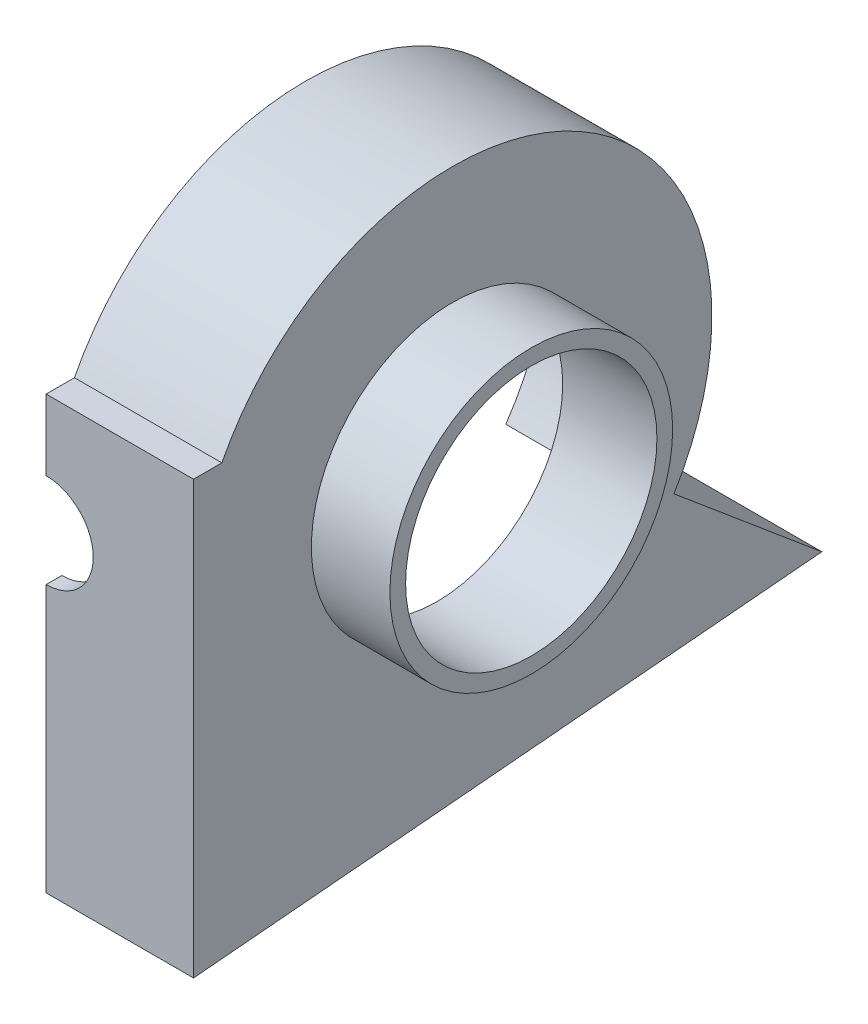
ISO-10303-21;
HEADER;
FILE_DESCRIPTION(('STEP AP214'),'2;1');
FILE_NAME('part.step','',(''),(''),'','','');
FILE_SCHEMA(('AUTOMOTIVE_DESIGN { 1 0 10303 214 1 1 1 1 }'));
ENDSEC;
DATA;
#1=APPLICATION_CONTEXT('core data for automotive mechanical design processes');
#2=APPLICATION_PROTOCOL_DEFINITION('international standard','automotive_design',2000,#1);
#3=PRODUCT_CONTEXT('',#1,'mechanical');
#4=PRODUCT('Part','Part','',(#3));
#5=PRODUCT_RELATED_PRODUCT_CATEGORY('part','',(#4));
#6=PRODUCT_DEFINITION_FORMATION('','',#4);
#7=PRODUCT_DEFINITION_CONTEXT('part definition',#1,'design');
#8=PRODUCT_DEFINITION('design','',#6,#7);
#9=PRODUCT_DEFINITION_SHAPE('','',#8);
#10=(LENGTH_UNIT() NAMED_UNIT(*) SI_UNIT(.MILLI.,.METRE.));
#11=(NAMED_UNIT(*) PLANE_ANGLE_UNIT() SI_UNIT($,.RADIAN.));
#12=(NAMED_UNIT(*) SI_UNIT($,.STERADIAN.) SOLID_ANGLE_UNIT());
#13=UNCERTAINTY_MEASURE_WITH_UNIT(LENGTH_MEASURE(1.E-05),#10,'distance_accuracy_value','');
#14=(GEOMETRIC_REPRESENTATION_CONTEXT(3) GLOBAL_UNCERTAINTY_ASSIGNED_CONTEXT((#13)) GLOBAL_UNIT_ASSIGNED_CONTEXT((#10,
#11,#12)) REPRESENTATION_CONTEXT('',''));
#15=CARTESIAN_POINT('',(0.,0.,0.));
#16=DIRECTION('',(0.,0.,1.));
#17=DIRECTION('',(1.,0.,0.));
#18=AXIS2_PLACEMENT_3D('',#15,#16,#17);
#19=CARTESIAN_POINT('',(-4.6925,35.,-20.));
#20=DIRECTION('',(1.,0.,0.));
#21=DIRECTION('',(0.,0.,1.));
#22=AXIS2_PLACEMENT_3D('',#19,#20,#21);
#23=PLANE('',#22);
#24=DIRECTION('',(0.,-1.,0.));
#25=VECTOR('',#24,1.);
#26=CARTESIAN_POINT('',(-4.6925,35.,19.));
#27=LINE('',#26,#25);
#28=CARTESIAN_POINT('',(-4.6925,13.5,19.));
#29=VERTEX_POINT('',#28);
#30=CARTESIAN_POINT('',(-4.6925,-2.40823803996742,19.));
#31=VERTEX_POINT('',#30);
#32=EDGE_CURVE('E194',#29,#31,#27,.T.);
#33=ORIENTED_EDGE('',*,*,#32,.T.);
#34=DIRECTION('',(0.,0.0871557427476513,-0.996194698091746));
#35=VECTOR('',#34,1.);
#36=CARTESIAN_POINT('',(-4.6925,1.26205902037806,-22.9516873664234));
#37=LINE('',#36,#35);
#38=CARTESIAN_POINT('',(-4.6925,0.785782121911663,-17.5078175063551));
#39=VERTEX_POINT('',#38);
#40=EDGE_CURVE('E161',#31,#39,#37,.T.);
#41=ORIENTED_EDGE('',*,*,#40,.T.);
#42=DIRECTION('',(0.,-0.642787609686538,-0.766044443118979));
#43=VECTOR('',#42,1.);
#44=CARTESIAN_POINT('',(-4.6925,13.6951124477097,-2.12307671259983));
#45=LINE('',#44,#43);
#46=CARTESIAN_POINT('',(-4.6925,7.70429056918022,-9.26266020892933));
#47=VERTEX_POINT('',#46);
#48=EDGE_CURVE('E190',#47,#39,#45,.T.);
#49=ORIENTED_EDGE('',*,*,#48,.F.);
#50=CARTESIAN_POINT('',(-4.6925,16.5,3.5));
#51=DIRECTION('',(-1.,0.,0.));
#52=DIRECTION('',(0.,0.,1.));
#53=AXIS2_PLACEMENT_3D('',#50,#51,#52);
#54=CIRCLE('',#53,15.5);
#55=CARTESIAN_POINT('',(-4.6925,23.,17.5712472794703));
#56=VERTEX_POINT('',#55);
#57=EDGE_CURVE('E173',#56,#47,#54,.T.);
#58=ORIENTED_EDGE('',*,*,#57,.F.);
#59=DIRECTION('',(0.,0.,1.));
#60=VECTOR('',#59,1.);
#61=CARTESIAN_POINT('',(-4.6925,23.,-20.));
#62=LINE('',#61,#60);
#63=CARTESIAN_POINT('',(-4.6925,23.,19.));
#64=VERTEX_POINT('',#63);
#65=EDGE_CURVE('E200',#56,#64,#62,.T.);
#66=ORIENTED_EDGE('',*,*,#65,.T.);
#67=CARTESIAN_POINT('',(-4.6925,19.5,19.));
#68=VERTEX_POINT('',#67);
#69=EDGE_CURVE('E178',#64,#68,#27,.T.);
#70=ORIENTED_EDGE('',*,*,#69,.T.);
#71=DIRECTION('',(0.,0.,1.));
#72=VECTOR('',#71,1.);
#73=CARTESIAN_POINT('',(-4.6925,19.5,13.));
#74=LINE('',#73,#72);
#75=CARTESIAN_POINT('',(-4.6925,19.5,20.));
#76=VERTEX_POINT('',#75);
#77=EDGE_CURVE('E140',#68,#76,#74,.T.);
#78=ORIENTED_EDGE('',*,*,#77,.T.);
#79=DIRECTION('',(0.,-1.,0.));
#80=VECTOR('',#79,1.);
#81=CARTESIAN_POINT('',(-4.6925,35.,20.));
#82=LINE('',#81,#80);
#83=CARTESIAN_POINT('',(-4.6925,24.,20.));
#84=VERTEX_POINT('',#83);
#85=EDGE_CURVE('E132',#84,#76,#82,.T.);
#86=ORIENTED_EDGE('',*,*,#85,.F.);
#87=DIRECTION('',(0.,0.,1.));
#88=VECTOR('',#87,1.);
#89=CARTESIAN_POINT('',(-4.6925,24.,0.));
#90=LINE('',#89,#88);
#91=CARTESIAN_POINT('',(-4.6925,24.,18.1969384566991));
#92=VERTEX_POINT('',#91);
#93=EDGE_CURVE('E216',#92,#84,#90,.T.);
#94=ORIENTED_EDGE('',*,*,#93,.F.);
#95=CARTESIAN_POINT('',(-4.6925,16.5,3.5));
#96=DIRECTION('',(-1.,0.,0.));
#97=DIRECTION('',(0.,0.,1.));
#98=AXIS2_PLACEMENT_3D('',#95,#96,#97);
#99=CIRCLE('',#98,16.5);
#100=CARTESIAN_POINT('',(-4.6925,7.90199647080288,-10.5827673172539));
#101=VERTEX_POINT('',#100);
#102=EDGE_CURVE('E213',#92,#101,#99,.T.);
#103=ORIENTED_EDGE('',*,*,#102,.T.);
#104=DIRECTION('',(0.,-0.642787609686538,-0.766044443118979));
#105=VECTOR('',#104,1.);
#106=CARTESIAN_POINT('',(-4.6925,9.84807753012207,-8.26351822333066));
#107=LINE('',#106,#105);
#108=CARTESIAN_POINT('',(-4.6925,0.,-20.));
#109=VERTEX_POINT('',#108);
#110=EDGE_CURVE('E220',#101,#109,#107,.T.);
#111=ORIENTED_EDGE('',*,*,#110,.T.);
#112=DIRECTION('',(0.,0.0871557427476513,-0.996194698091746));
#113=VECTOR('',#112,1.);
#114=CARTESIAN_POINT('',(-4.6925,0.,-20.));
#115=LINE('',#114,#113);
#116=CARTESIAN_POINT('',(-4.6925,-3.49954654103668,20.));
#117=VERTEX_POINT('',#116);
#118=EDGE_CURVE('E144',#117,#109,#115,.T.);
#119=ORIENTED_EDGE('',*,*,#118,.F.);
#120=CARTESIAN_POINT('',(-4.6925,13.5,20.));
#121=VERTEX_POINT('',#120);
#122=EDGE_CURVE('E129',#121,#117,#82,.T.);
#123=ORIENTED_EDGE('',*,*,#122,.F.);
#124=DIRECTION('',(0.,0.,1.));
#125=VECTOR('',#124,1.);
#126=CARTESIAN_POINT('',(-4.6925,13.5,13.));
#127=LINE('',#126,#125);
#128=EDGE_CURVE('E134',#29,#121,#127,.T.);
#129=ORIENTED_EDGE('',*,*,#128,.F.);
#130=EDGE_LOOP('',(#33,#41,#49,#58,#66,#70,#78,#86,#94,#103,#111,#119,#123,#129));
#131=FACE_BOUND('',#130,.T.);
#132=ADVANCED_FACE('F37',(#131),#23,.F.);
#133=CARTESIAN_POINT('',(4.6925,35.,-20.));
#134=DIRECTION('',(-1.,0.,0.));
#135=DIRECTION('',(0.,0.,-1.));
#136=AXIS2_PLACEMENT_3D('',#133,#134,#135);
#137=PLANE('',#136);
#138=CARTESIAN_POINT('',(4.6925,16.5,3.5));
#139=DIRECTION('',(1.,0.,0.));
#140=DIRECTION('',(0.,0.,-1.));
#141=AXIS2_PLACEMENT_3D('',#138,#139,#140);
#142=CIRCLE('',#141,9.00000000000001);
#143=CARTESIAN_POINT('',(4.6925,16.5,-5.50000000000001));
#144=VERTEX_POINT('',#143);
#145=EDGE_CURVE('E45',#144,#144,#142,.F.);
#146=ORIENTED_EDGE('',*,*,#145,.T.);
#147=EDGE_LOOP('',(#146));
#148=FACE_BOUND('',#147,.T.);
#149=DIRECTION('',(0.,-0.642787609686538,-0.766044443118979));
#150=VECTOR('',#149,1.);
#151=CARTESIAN_POINT('',(4.6925,9.84807753012207,-8.26351822333066));
#152=LINE('',#151,#150);
#153=CARTESIAN_POINT('',(4.6925,7.90199647080288,-10.5827673172539));
#154=VERTEX_POINT('',#153);
#155=CARTESIAN_POINT('',(4.6925,0.,-20.));
#156=VERTEX_POINT('',#155);
#157=EDGE_CURVE('E217',#154,#156,#152,.T.);
#158=ORIENTED_EDGE('',*,*,#157,.F.);
#159=CARTESIAN_POINT('',(4.6925,16.5,3.5));
#160=DIRECTION('',(-1.,0.,0.));
#161=DIRECTION('',(0.,0.,1.));
#162=AXIS2_PLACEMENT_3D('',#159,#160,#161);
#163=CIRCLE('',#162,16.5);
#164=CARTESIAN_POINT('',(4.6925,24.,18.1969384566991));
#165=VERTEX_POINT('',#164);
#166=EDGE_CURVE('E212',#165,#154,#163,.T.);
#167=ORIENTED_EDGE('',*,*,#166,.F.);
#168=DIRECTION('',(0.,0.,1.));
#169=VECTOR('',#168,1.);
#170=CARTESIAN_POINT('',(4.6925,24.,0.));
#171=LINE('',#170,#169);
#172=CARTESIAN_POINT('',(4.6925,24.,20.));
#173=VERTEX_POINT('',#172);
#174=EDGE_CURVE('E225',#165,#173,#171,.T.);
#175=ORIENTED_EDGE('',*,*,#174,.T.);
#176=DIRECTION('',(0.,-1.,0.));
#177=VECTOR('',#176,1.);
#178=CARTESIAN_POINT('',(4.6925,35.,20.));
#179=LINE('',#178,#177);
#180=CARTESIAN_POINT('',(4.6925,-3.49954654103668,20.));
#181=VERTEX_POINT('',#180);
#182=EDGE_CURVE('E147',#173,#181,#179,.T.);
#183=ORIENTED_EDGE('',*,*,#182,.T.);
#184=DIRECTION('',(0.,0.0871557427476513,-0.996194698091746));
#185=VECTOR('',#184,1.);
#186=CARTESIAN_POINT('',(4.6925,0.,-20.));
#187=LINE('',#186,#185);
#188=EDGE_CURVE('E169',#181,#156,#187,.T.);
#189=ORIENTED_EDGE('',*,*,#188,.T.);
#190=EDGE_LOOP('',(#158,#167,#175,#183,#189));
#191=FACE_BOUND('',#190,.T.);
#192=ADVANCED_FACE('F39',(#148,#191),#137,.F.);
#193=CARTESIAN_POINT('',(-4.6925,35.,20.));
#194=DIRECTION('',(0.,0.,-1.));
#195=DIRECTION('',(1.,0.,0.));
#196=AXIS2_PLACEMENT_3D('',#193,#194,#195);
#197=PLANE('',#196);
#198=ORIENTED_EDGE('',*,*,#122,.T.);
#199=DIRECTION('',(1.,0.,0.));
#200=VECTOR('',#199,1.);
#201=CARTESIAN_POINT('',(-4.6925,-3.49954654103668,20.));
#202=LINE('',#201,#200);
#203=EDGE_CURVE('E205',#117,#181,#202,.T.);
#204=ORIENTED_EDGE('',*,*,#203,.T.);
#205=ORIENTED_EDGE('',*,*,#182,.F.);
#206=DIRECTION('',(1.,0.,0.));
#207=VECTOR('',#206,1.);
#208=CARTESIAN_POINT('',(-4.6925,24.,20.));
#209=LINE('',#208,#207);
#210=EDGE_CURVE('E231',#84,#173,#209,.T.);
#211=ORIENTED_EDGE('',*,*,#210,.F.);
#212=ORIENTED_EDGE('',*,*,#85,.T.);
#213=CARTESIAN_POINT('',(-4.6925,16.5,20.));
#214=DIRECTION('',(0.,0.,-1.));
#215=DIRECTION('',(-1.,0.,0.));
#216=AXIS2_PLACEMENT_3D('',#213,#214,#215);
#217=CIRCLE('',#216,3.);
#218=EDGE_CURVE('E126',#76,#121,#217,.T.);
#219=ORIENTED_EDGE('',*,*,#218,.T.);
#220=EDGE_LOOP('',(#198,#204,#205,#211,#212,#219));
#221=FACE_BOUND('',#220,.T.);
#222=ADVANCED_FACE('F127',(#221),#197,.F.);
#223=CARTESIAN_POINT('',(-4.6925,16.5,3.5));
#224=DIRECTION('',(1.,0.,0.));
#225=DIRECTION('',(0.,0.,1.));
#226=AXIS2_PLACEMENT_3D('',#223,#224,#225);
#227=CYLINDRICAL_SURFACE('',#226,16.5);
#228=ORIENTED_EDGE('',*,*,#166,.T.);
#229=DIRECTION('',(1.,0.,0.));
#230=VECTOR('',#229,1.);
#231=CARTESIAN_POINT('',(-4.6925,7.90199647080288,-10.5827673172539));
#232=LINE('',#231,#230);
#233=EDGE_CURVE('E148',#101,#154,#232,.T.);
#234=ORIENTED_EDGE('',*,*,#233,.F.);
#235=ORIENTED_EDGE('',*,*,#102,.F.);
#236=DIRECTION('',(1.,0.,0.));
#237=VECTOR('',#236,1.);
#238=CARTESIAN_POINT('',(-4.6925,24.,18.1969384566991));
#239=LINE('',#238,#237);
#240=EDGE_CURVE('E222',#92,#165,#239,.T.);
#241=ORIENTED_EDGE('',*,*,#240,.T.);
#242=EDGE_LOOP('',(#228,#234,#235,#241));
#243=FACE_BOUND('',#242,.T.);
#244=ADVANCED_FACE('F235',(#243),#227,.T.);
#245=CARTESIAN_POINT('',(-4.6925,9.84807753012207,-8.26351822333066));
#246=DIRECTION('',(0.,0.766044443118979,-0.642787609686538));
#247=DIRECTION('',(0.,-0.642787609686538,-0.766044443118979));
#248=AXIS2_PLACEMENT_3D('',#245,#246,#247);
#249=PLANE('',#248);
#250=ORIENTED_EDGE('',*,*,#157,.T.);
#251=DIRECTION('',(1.,0.,0.));
#252=VECTOR('',#251,1.);
#253=CARTESIAN_POINT('',(-4.6925,0.,-20.));
#254=LINE('',#253,#252);
#255=EDGE_CURVE('E145',#109,#156,#254,.T.);
#256=ORIENTED_EDGE('',*,*,#255,.F.);
#257=ORIENTED_EDGE('',*,*,#110,.F.);
#258=ORIENTED_EDGE('',*,*,#233,.T.);
#259=EDGE_LOOP('',(#250,#256,#257,#258));
#260=FACE_BOUND('',#259,.T.);
#261=ADVANCED_FACE('F245',(#260),#249,.T.);
#262=CARTESIAN_POINT('',(-4.6925,24.,0.));
#263=DIRECTION('',(0.,-1.,0.));
#264=DIRECTION('',(0.,0.,1.));
#265=AXIS2_PLACEMENT_3D('',#262,#263,#264);
#266=PLANE('',#265);
#267=ORIENTED_EDGE('',*,*,#174,.F.);
#268=ORIENTED_EDGE('',*,*,#240,.F.);
#269=ORIENTED_EDGE('',*,*,#93,.T.);
#270=ORIENTED_EDGE('',*,*,#210,.T.);
#271=EDGE_LOOP('',(#267,#268,#269,#270));
#272=FACE_BOUND('',#271,.T.);
#273=ADVANCED_FACE('F240',(#272),#266,.F.);
#274=CARTESIAN_POINT('',(9.6925,16.5,3.5));
#275=DIRECTION('',(-1.,0.,0.));
#276=DIRECTION('',(0.,0.,-1.));
#277=AXIS2_PLACEMENT_3D('',#274,#275,#276);
#278=CYLINDRICAL_SURFACE('',#277,9.00000000000001);
#279=CARTESIAN_POINT('',(9.6925,16.5,3.5));
#280=DIRECTION('',(-1.,0.,0.));
#281=DIRECTION('',(0.,0.,1.));
#282=AXIS2_PLACEMENT_3D('',#279,#280,#281);
#283=CIRCLE('',#282,9.00000000000001);
#284=CARTESIAN_POINT('',(9.6925,16.5,12.5));
#285=VERTEX_POINT('',#284);
#286=EDGE_CURVE('E209',#285,#285,#283,.T.);
#287=ORIENTED_EDGE('',*,*,#286,.T.);
#288=EDGE_LOOP('',(#287));
#289=FACE_BOUND('',#288,.T.);
#290=ORIENTED_EDGE('',*,*,#145,.F.);
#291=EDGE_LOOP('',(#290));
#292=FACE_BOUND('',#291,.T.);
#293=ADVANCED_FACE('F260',(#289,#292),#278,.T.);
#294=CARTESIAN_POINT('',(9.6925,16.5,3.5));
#295=DIRECTION('',(1.,0.,0.));
#296=DIRECTION('',(0.,0.,1.));
#297=AXIS2_PLACEMENT_3D('',#294,#295,#296);
#298=PLANE('',#297);
#299=CARTESIAN_POINT('',(9.6925,16.5,3.5));
#300=DIRECTION('',(-1.,0.,0.));
#301=DIRECTION('',(0.,0.,1.));
#302=AXIS2_PLACEMENT_3D('',#299,#300,#301);
#303=CIRCLE('',#302,8.);
#304=CARTESIAN_POINT('',(9.6925,16.5,11.5));
#305=VERTEX_POINT('',#304);
#306=EDGE_CURVE('E155',#305,#305,#303,.T.);
#307=ORIENTED_EDGE('',*,*,#306,.T.);
#308=EDGE_LOOP('',(#307));
#309=FACE_BOUND('',#308,.T.);
#310=ORIENTED_EDGE('',*,*,#286,.F.);
#311=EDGE_LOOP('',(#310));
#312=FACE_BOUND('',#311,.T.);
#313=ADVANCED_FACE('F251',(#309,#312),#298,.T.);
#314=CARTESIAN_POINT('',(-4.6925,0.,-20.));
#315=DIRECTION('',(0.,0.996194698091746,0.0871557427476513));
#316=DIRECTION('',(0.,0.0871557427476513,-0.996194698091746));
#317=AXIS2_PLACEMENT_3D('',#314,#315,#316);
#318=PLANE('',#317);
#319=ORIENTED_EDGE('',*,*,#188,.F.);
#320=ORIENTED_EDGE('',*,*,#203,.F.);
#321=ORIENTED_EDGE('',*,*,#118,.T.);
#322=ORIENTED_EDGE('',*,*,#255,.T.);
#323=EDGE_LOOP('',(#319,#320,#321,#322));
#324=FACE_BOUND('',#323,.T.);
#325=ADVANCED_FACE('F248',(#324),#318,.F.);
#326=CARTESIAN_POINT('',(3.6925,35.,-20.));
#327=DIRECTION('',(-1.,0.,0.));
#328=DIRECTION('',(0.,0.,-1.));
#329=AXIS2_PLACEMENT_3D('',#326,#327,#328);
#330=PLANE('',#329);
#331=CARTESIAN_POINT('',(3.6925,16.5,3.5));
#332=DIRECTION('',(1.,0.,0.));
#333=DIRECTION('',(0.,0.,-1.));
#334=AXIS2_PLACEMENT_3D('',#331,#332,#333);
#335=CIRCLE('',#334,8.);
#336=CARTESIAN_POINT('',(3.6925,16.5,-4.5));
#337=VERTEX_POINT('',#336);
#338=EDGE_CURVE('E166',#337,#337,#335,.F.);
#339=ORIENTED_EDGE('',*,*,#338,.F.);
#340=EDGE_LOOP('',(#339));
#341=FACE_BOUND('',#340,.T.);
#342=DIRECTION('',(0.,-0.642787609686538,-0.766044443118979));
#343=VECTOR('',#342,1.);
#344=CARTESIAN_POINT('',(3.6925,9.0820330870031,-7.62073061364412));
#345=LINE('',#344,#343);
#346=CARTESIAN_POINT('',(3.6925,7.70429056918022,-9.26266020892933));
#347=VERTEX_POINT('',#346);
#348=CARTESIAN_POINT('',(3.6925,0.785782121911663,-17.5078175063551));
#349=VERTEX_POINT('',#348);
#350=EDGE_CURVE('E171',#347,#349,#345,.T.);
#351=ORIENTED_EDGE('',*,*,#350,.T.);
#352=DIRECTION('',(0.,0.0871557427476513,-0.996194698091746));
#353=VECTOR('',#352,1.);
#354=CARTESIAN_POINT('',(3.6925,0.996194698091746,-19.9128442572523));
#355=LINE('',#354,#353);
#356=CARTESIAN_POINT('',(3.6925,-2.40823803996742,19.));
#357=VERTEX_POINT('',#356);
#358=EDGE_CURVE('E157',#357,#349,#355,.T.);
#359=ORIENTED_EDGE('',*,*,#358,.F.);
#360=DIRECTION('',(0.,-1.,0.));
#361=VECTOR('',#360,1.);
#362=CARTESIAN_POINT('',(3.6925,35.,19.));
#363=LINE('',#362,#361);
#364=CARTESIAN_POINT('',(3.6925,23.,19.));
#365=VERTEX_POINT('',#364);
#366=EDGE_CURVE('E170',#365,#357,#363,.T.);
#367=ORIENTED_EDGE('',*,*,#366,.F.);
#368=DIRECTION('',(0.,0.,1.));
#369=VECTOR('',#368,1.);
#370=CARTESIAN_POINT('',(3.6925,23.,0.));
#371=LINE('',#370,#369);
#372=CARTESIAN_POINT('',(3.6925,23.,17.5712472794703));
#373=VERTEX_POINT('',#372);
#374=EDGE_CURVE('E174',#373,#365,#371,.T.);
#375=ORIENTED_EDGE('',*,*,#374,.F.);
#376=CARTESIAN_POINT('',(3.6925,16.5,3.5));
#377=DIRECTION('',(1.,0.,0.));
#378=DIRECTION('',(0.,0.,-1.));
#379=AXIS2_PLACEMENT_3D('',#376,#377,#378);
#380=CIRCLE('',#379,15.5);
#381=EDGE_CURVE('E181',#373,#347,#380,.F.);
#382=ORIENTED_EDGE('',*,*,#381,.T.);
#383=EDGE_LOOP('',(#351,#359,#367,#375,#382));
#384=FACE_BOUND('',#383,.T.);
#385=ADVANCED_FACE('F250',(#341,#384),#330,.T.);
#386=CARTESIAN_POINT('',(-4.6925,35.,19.));
#387=DIRECTION('',(0.,0.,-1.));
#388=DIRECTION('',(1.,0.,0.));
#389=AXIS2_PLACEMENT_3D('',#386,#387,#388);
#390=PLANE('',#389);
#391=CARTESIAN_POINT('',(-4.6925,16.5,19.));
#392=DIRECTION('',(0.,0.,1.));
#393=DIRECTION('',(1.,0.,0.));
#394=AXIS2_PLACEMENT_3D('',#391,#392,#393);
#395=CIRCLE('',#394,3.);
#396=EDGE_CURVE('E11',#29,#68,#395,.T.);
#397=ORIENTED_EDGE('',*,*,#396,.T.);
#398=ORIENTED_EDGE('',*,*,#69,.F.);
#399=DIRECTION('',(1.,0.,0.));
#400=VECTOR('',#399,1.);
#401=CARTESIAN_POINT('',(-4.6925,23.,19.));
#402=LINE('',#401,#400);
#403=EDGE_CURVE('E186',#64,#365,#402,.T.);
#404=ORIENTED_EDGE('',*,*,#403,.T.);
#405=ORIENTED_EDGE('',*,*,#366,.T.);
#406=DIRECTION('',(1.,0.,0.));
#407=VECTOR('',#406,1.);
#408=CARTESIAN_POINT('',(-4.6925,-2.40823803996742,19.));
#409=LINE('',#408,#407);
#410=EDGE_CURVE('E184',#31,#357,#409,.T.);
#411=ORIENTED_EDGE('',*,*,#410,.F.);
#412=ORIENTED_EDGE('',*,*,#32,.F.);
#413=EDGE_LOOP('',(#397,#398,#404,#405,#411,#412));
#414=FACE_BOUND('',#413,.T.);
#415=ADVANCED_FACE('F257',(#414),#390,.T.);
#416=CARTESIAN_POINT('',(-4.6925,16.5,3.5));
#417=DIRECTION('',(1.,0.,0.));
#418=DIRECTION('',(0.,0.,1.));
#419=AXIS2_PLACEMENT_3D('',#416,#417,#418);
#420=CYLINDRICAL_SURFACE('',#419,15.5);
#421=ORIENTED_EDGE('',*,*,#381,.F.);
#422=DIRECTION('',(1.,0.,0.));
#423=VECTOR('',#422,1.);
#424=CARTESIAN_POINT('',(-4.6925,23.,17.5712472794703));
#425=LINE('',#424,#423);
#426=EDGE_CURVE('E58',#56,#373,#425,.T.);
#427=ORIENTED_EDGE('',*,*,#426,.F.);
#428=ORIENTED_EDGE('',*,*,#57,.T.);
#429=DIRECTION('',(1.,0.,0.));
#430=VECTOR('',#429,1.);
#431=CARTESIAN_POINT('',(-4.6925,7.70429056918022,-9.26266020892933));
#432=LINE('',#431,#430);
#433=EDGE_CURVE('E188',#47,#347,#432,.T.);
#434=ORIENTED_EDGE('',*,*,#433,.T.);
#435=EDGE_LOOP('',(#421,#427,#428,#434));
#436=FACE_BOUND('',#435,.T.);
#437=ADVANCED_FACE('F318',(#436),#420,.F.);
#438=CARTESIAN_POINT('',(-4.6925,9.0820330870031,-7.62073061364412));
#439=DIRECTION('',(0.,0.766044443118979,-0.642787609686538));
#440=DIRECTION('',(0.,-0.642787609686538,-0.766044443118979));
#441=AXIS2_PLACEMENT_3D('',#438,#439,#440);
#442=PLANE('',#441);
#443=ORIENTED_EDGE('',*,*,#350,.F.);
#444=ORIENTED_EDGE('',*,*,#433,.F.);
#445=ORIENTED_EDGE('',*,*,#48,.T.);
#446=DIRECTION('',(1.,0.,0.));
#447=VECTOR('',#446,1.);
#448=CARTESIAN_POINT('',(-4.6925,0.785782121911663,-17.5078175063551));
#449=LINE('',#448,#447);
#450=EDGE_CURVE('E192',#39,#349,#449,.T.);
#451=ORIENTED_EDGE('',*,*,#450,.T.);
#452=EDGE_LOOP('',(#443,#444,#445,#451));
#453=FACE_BOUND('',#452,.T.);
#454=ADVANCED_FACE('F328',(#453),#442,.F.);
#455=CARTESIAN_POINT('',(-4.6925,23.,0.));
#456=DIRECTION('',(0.,-1.,0.));
#457=DIRECTION('',(0.,0.,1.));
#458=AXIS2_PLACEMENT_3D('',#455,#456,#457);
#459=PLANE('',#458);
#460=ORIENTED_EDGE('',*,*,#374,.T.);
#461=ORIENTED_EDGE('',*,*,#403,.F.);
#462=ORIENTED_EDGE('',*,*,#65,.F.);
#463=ORIENTED_EDGE('',*,*,#426,.T.);
#464=EDGE_LOOP('',(#460,#461,#462,#463));
#465=FACE_BOUND('',#464,.T.);
#466=ADVANCED_FACE('F337',(#465),#459,.T.);
#467=CARTESIAN_POINT('',(9.6925,16.5,3.5));
#468=DIRECTION('',(-1.,0.,0.));
#469=DIRECTION('',(0.,0.,-1.));
#470=AXIS2_PLACEMENT_3D('',#467,#468,#469);
#471=CYLINDRICAL_SURFACE('',#470,8.);
#472=ORIENTED_EDGE('',*,*,#338,.T.);
#473=EDGE_LOOP('',(#472));
#474=FACE_BOUND('',#473,.T.);
#475=ORIENTED_EDGE('',*,*,#306,.F.);
#476=EDGE_LOOP('',(#475));
#477=FACE_BOUND('',#476,.T.);
#478=ADVANCED_FACE('F347',(#474,#477),#471,.F.);
#479=CARTESIAN_POINT('',(-4.6925,0.996194698091746,-19.9128442572523));
#480=DIRECTION('',(0.,0.996194698091746,0.0871557427476513));
#481=DIRECTION('',(0.,0.0871557427476513,-0.996194698091746));
#482=AXIS2_PLACEMENT_3D('',#479,#480,#481);
#483=PLANE('',#482);
#484=ORIENTED_EDGE('',*,*,#358,.T.);
#485=ORIENTED_EDGE('',*,*,#450,.F.);
#486=ORIENTED_EDGE('',*,*,#40,.F.);
#487=ORIENTED_EDGE('',*,*,#410,.T.);
#488=EDGE_LOOP('',(#484,#485,#486,#487));
#489=FACE_BOUND('',#488,.T.);
#490=ADVANCED_FACE('F358',(#489),#483,.T.);
#491=CARTESIAN_POINT('',(-4.6925,16.5,13.));
#492=DIRECTION('',(0.,0.,1.));
#493=DIRECTION('',(-1.,0.,0.));
#494=AXIS2_PLACEMENT_3D('',#491,#492,#493);
#495=CYLINDRICAL_SURFACE('',#494,3.);
#496=ORIENTED_EDGE('',*,*,#396,.F.);
#497=ORIENTED_EDGE('',*,*,#128,.T.);
#498=ORIENTED_EDGE('',*,*,#218,.F.);
#499=ORIENTED_EDGE('',*,*,#77,.F.);
#500=EDGE_LOOP('',(#496,#497,#498,#499));
#501=FACE_BOUND('',#500,.T.);
#502=ADVANCED_FACE('F136',(#501),#495,.F.);
#503=CLOSED_SHELL('',(#132,#192,#222,#244,#261,#273,#293,#313,#325,#385,#415,#437,#454,#466,
#478,#490,#502));
#504=MANIFOLD_SOLID_BREP('B2',#503);
#505=ADVANCED_BREP_SHAPE_REPRESENTATION('',(#18,#504),#14);
#506=SHAPE_DEFINITION_REPRESENTATION(#9,#505);
ENDSEC;
END-ISO-10303-21;
